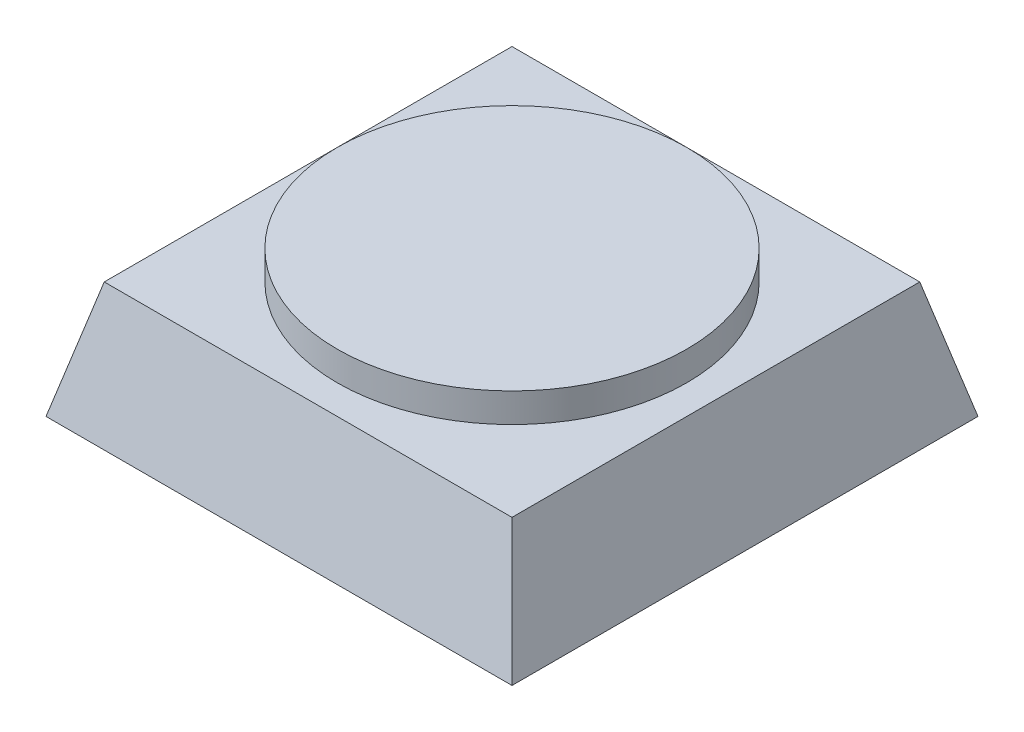
ISO-10303-21;
HEADER;
FILE_DESCRIPTION(('STEP AP214'),'2;1');
FILE_NAME('part.step','',(''),(''),'','','');
FILE_SCHEMA(('AUTOMOTIVE_DESIGN { 1 0 10303 214 1 1 1 1 }'));
ENDSEC;
DATA;
#1=APPLICATION_CONTEXT('core data for automotive mechanical design processes');
#2=APPLICATION_PROTOCOL_DEFINITION('international standard','automotive_design',2000,#1);
#3=PRODUCT_CONTEXT('',#1,'mechanical');
#4=PRODUCT('Part','Part','',(#3));
#5=PRODUCT_RELATED_PRODUCT_CATEGORY('part','',(#4));
#6=PRODUCT_DEFINITION_FORMATION('','',#4);
#7=PRODUCT_DEFINITION_CONTEXT('part definition',#1,'design');
#8=PRODUCT_DEFINITION('design','',#6,#7);
#9=PRODUCT_DEFINITION_SHAPE('','',#8);
#10=(LENGTH_UNIT() NAMED_UNIT(*) SI_UNIT(.MILLI.,.METRE.));
#11=(NAMED_UNIT(*) PLANE_ANGLE_UNIT() SI_UNIT($,.RADIAN.));
#12=(NAMED_UNIT(*) SI_UNIT($,.STERADIAN.) SOLID_ANGLE_UNIT());
#13=UNCERTAINTY_MEASURE_WITH_UNIT(LENGTH_MEASURE(1.E-05),#10,'distance_accuracy_value','');
#14=(GEOMETRIC_REPRESENTATION_CONTEXT(3) GLOBAL_UNCERTAINTY_ASSIGNED_CONTEXT((#13)) GLOBAL_UNIT_ASSIGNED_CONTEXT((#10,
#11,#12)) REPRESENTATION_CONTEXT('',''));
#15=CARTESIAN_POINT('',(0.,0.,0.));
#16=DIRECTION('',(0.,0.,1.));
#17=DIRECTION('',(1.,0.,0.));
#18=AXIS2_PLACEMENT_3D('',#15,#16,#17);
#19=CARTESIAN_POINT('',(0.,20.,0.));
#20=DIRECTION('',(0.,-1.,0.));
#21=DIRECTION('',(0.,0.,-1.));
#22=AXIS2_PLACEMENT_3D('',#19,#20,#21);
#23=PLANE('',#22);
#24=DIRECTION('',(1.,0.,0.));
#25=VECTOR('',#24,1.);
#26=CARTESIAN_POINT('',(0.,20.,35.));
#27=LINE('',#26,#25);
#28=CARTESIAN_POINT('',(-35.,20.,35.));
#29=VERTEX_POINT('',#28);
#30=CARTESIAN_POINT('',(35.,20.,35.));
#31=VERTEX_POINT('',#30);
#32=EDGE_CURVE('E122',#29,#31,#27,.T.);
#33=ORIENTED_EDGE('',*,*,#32,.T.);
#34=DIRECTION('',(0.,0.,-1.));
#35=VECTOR('',#34,1.);
#36=CARTESIAN_POINT('',(35.,20.,0.));
#37=LINE('',#36,#35);
#38=CARTESIAN_POINT('',(35.,20.,-35.));
#39=VERTEX_POINT('',#38);
#40=EDGE_CURVE('E11',#31,#39,#37,.T.);
#41=ORIENTED_EDGE('',*,*,#40,.T.);
#42=DIRECTION('',(-1.,0.,0.));
#43=VECTOR('',#42,1.);
#44=CARTESIAN_POINT('',(0.,20.,-35.));
#45=LINE('',#44,#43);
#46=CARTESIAN_POINT('',(-35.,20.,-35.));
#47=VERTEX_POINT('',#46);
#48=EDGE_CURVE('E49',#39,#47,#45,.T.);
#49=ORIENTED_EDGE('',*,*,#48,.T.);
#50=DIRECTION('',(0.,0.,1.));
#51=VECTOR('',#50,1.);
#52=CARTESIAN_POINT('',(-35.,20.,0.));
#53=LINE('',#52,#51);
#54=EDGE_CURVE('E131',#47,#29,#53,.T.);
#55=ORIENTED_EDGE('',*,*,#54,.T.);
#56=EDGE_LOOP('',(#33,#41,#49,#55));
#57=FACE_BOUND('',#56,.T.);
#58=CARTESIAN_POINT('',(0.,20.,0.));
#59=DIRECTION('',(0.,1.,0.));
#60=DIRECTION('',(0.,0.,1.));
#61=AXIS2_PLACEMENT_3D('',#58,#59,#60);
#62=CIRCLE('',#61,30.);
#63=CARTESIAN_POINT('',(0.,20.,30.));
#64=VERTEX_POINT('',#63);
#65=EDGE_CURVE('E119',#64,#64,#62,.T.);
#66=ORIENTED_EDGE('',*,*,#65,.F.);
#67=EDGE_LOOP('',(#66));
#68=FACE_BOUND('',#67,.T.);
#69=ADVANCED_FACE('F39',(#57,#68),#23,.F.);
#70=CARTESIAN_POINT('',(0.,0.,0.));
#71=DIRECTION('',(0.,-1.,0.));
#72=DIRECTION('',(0.,0.,-1.));
#73=AXIS2_PLACEMENT_3D('',#70,#71,#72);
#74=PLANE('',#73);
#75=DIRECTION('',(0.,0.,-1.));
#76=VECTOR('',#75,1.);
#77=CARTESIAN_POINT('',(40.,0.,40.));
#78=LINE('',#77,#76);
#79=CARTESIAN_POINT('',(40.,0.,40.));
#80=VERTEX_POINT('',#79);
#81=CARTESIAN_POINT('',(40.,0.,-40.));
#82=VERTEX_POINT('',#81);
#83=EDGE_CURVE('E85',#80,#82,#78,.T.);
#84=ORIENTED_EDGE('',*,*,#83,.F.);
#85=DIRECTION('',(1.,0.,0.));
#86=VECTOR('',#85,1.);
#87=CARTESIAN_POINT('',(-40.,0.,40.));
#88=LINE('',#87,#86);
#89=CARTESIAN_POINT('',(-40.,0.,40.));
#90=VERTEX_POINT('',#89);
#91=EDGE_CURVE('E123',#90,#80,#88,.T.);
#92=ORIENTED_EDGE('',*,*,#91,.F.);
#93=DIRECTION('',(0.,0.,1.));
#94=VECTOR('',#93,1.);
#95=CARTESIAN_POINT('',(-40.,0.,40.));
#96=LINE('',#95,#94);
#97=CARTESIAN_POINT('',(-40.,0.,-40.));
#98=VERTEX_POINT('',#97);
#99=EDGE_CURVE('E87',#98,#90,#96,.T.);
#100=ORIENTED_EDGE('',*,*,#99,.F.);
#101=DIRECTION('',(-1.,0.,0.));
#102=VECTOR('',#101,1.);
#103=CARTESIAN_POINT('',(-40.,0.,-40.));
#104=LINE('',#103,#102);
#105=EDGE_CURVE('E83',#82,#98,#104,.T.);
#106=ORIENTED_EDGE('',*,*,#105,.F.);
#107=EDGE_LOOP('',(#84,#92,#100,#106));
#108=FACE_BOUND('',#107,.T.);
#109=ADVANCED_FACE('F84',(#108),#74,.T.);
#110=CARTESIAN_POINT('',(0.,25.,0.));
#111=DIRECTION('',(0.,-1.,0.));
#112=DIRECTION('',(0.,0.,-1.));
#113=AXIS2_PLACEMENT_3D('',#110,#111,#112);
#114=CYLINDRICAL_SURFACE('',#113,30.);
#115=CARTESIAN_POINT('',(0.,25.,0.));
#116=DIRECTION('',(0.,1.,0.));
#117=DIRECTION('',(0.,0.,1.));
#118=AXIS2_PLACEMENT_3D('',#115,#116,#117);
#119=CIRCLE('',#118,30.);
#120=CARTESIAN_POINT('',(0.,25.,30.));
#121=VERTEX_POINT('',#120);
#122=EDGE_CURVE('E98',#121,#121,#119,.T.);
#123=ORIENTED_EDGE('',*,*,#122,.F.);
#124=EDGE_LOOP('',(#123));
#125=FACE_BOUND('',#124,.T.);
#126=ORIENTED_EDGE('',*,*,#65,.T.);
#127=EDGE_LOOP('',(#126));
#128=FACE_BOUND('',#127,.T.);
#129=ADVANCED_FACE('F149',(#125,#128),#114,.T.);
#130=CARTESIAN_POINT('',(0.,25.,0.));
#131=DIRECTION('',(0.,1.,0.));
#132=DIRECTION('',(0.,0.,1.));
#133=AXIS2_PLACEMENT_3D('',#130,#131,#132);
#134=PLANE('',#133);
#135=ORIENTED_EDGE('',*,*,#122,.T.);
#136=EDGE_LOOP('',(#135));
#137=FACE_BOUND('',#136,.T.);
#138=ADVANCED_FACE('F143',(#137),#134,.T.);
#139=CARTESIAN_POINT('',(-35.,20.,0.));
#140=DIRECTION('',(0.970142500145333,-0.24253562503633,0.));
#141=DIRECTION('',(0.,0.,1.));
#142=AXIS2_PLACEMENT_3D('',#139,#140,#141);
#143=PLANE('',#142);
#144=DIRECTION('',(-0.235702260395513,-0.942809041582065,-0.235702260395513));
#145=VECTOR('',#144,1.);
#146=CARTESIAN_POINT('',(-33.0555555555556,27.7777777777777,-33.0555555555556));
#147=LINE('',#146,#145);
#148=EDGE_CURVE('E104',#98,#47,#147,.F.);
#149=ORIENTED_EDGE('',*,*,#148,.F.);
#150=ORIENTED_EDGE('',*,*,#99,.T.);
#151=DIRECTION('',(-0.235702260395513,-0.942809041582065,0.235702260395513));
#152=VECTOR('',#151,1.);
#153=CARTESIAN_POINT('',(-33.0555555555556,27.7777777777777,33.0555555555556));
#154=LINE('',#153,#152);
#155=EDGE_CURVE('E43',#29,#90,#154,.T.);
#156=ORIENTED_EDGE('',*,*,#155,.F.);
#157=ORIENTED_EDGE('',*,*,#54,.F.);
#158=EDGE_LOOP('',(#149,#150,#156,#157));
#159=FACE_BOUND('',#158,.T.);
#160=ADVANCED_FACE('F41',(#159),#143,.F.);
#161=CARTESIAN_POINT('',(0.,20.,35.));
#162=DIRECTION('',(0.,-0.24253562503633,-0.970142500145333));
#163=DIRECTION('',(1.,0.,0.));
#164=AXIS2_PLACEMENT_3D('',#161,#162,#163);
#165=PLANE('',#164);
#166=ORIENTED_EDGE('',*,*,#155,.T.);
#167=ORIENTED_EDGE('',*,*,#91,.T.);
#168=DIRECTION('',(-0.235702260395513,0.942809041582065,-0.235702260395513));
#169=VECTOR('',#168,1.);
#170=CARTESIAN_POINT('',(33.0555555555556,27.7777777777777,33.0555555555556));
#171=LINE('',#170,#169);
#172=EDGE_CURVE('E95',#31,#80,#171,.F.);
#173=ORIENTED_EDGE('',*,*,#172,.F.);
#174=ORIENTED_EDGE('',*,*,#32,.F.);
#175=EDGE_LOOP('',(#166,#167,#173,#174));
#176=FACE_BOUND('',#175,.T.);
#177=ADVANCED_FACE('F136',(#176),#165,.F.);
#178=CARTESIAN_POINT('',(0.,20.,-35.));
#179=DIRECTION('',(0.,-0.24253562503633,0.970142500145333));
#180=DIRECTION('',(-1.,0.,0.));
#181=AXIS2_PLACEMENT_3D('',#178,#179,#180);
#182=PLANE('',#181);
#183=ORIENTED_EDGE('',*,*,#148,.T.);
#184=ORIENTED_EDGE('',*,*,#48,.F.);
#185=DIRECTION('',(0.235702260395513,-0.942809041582065,-0.235702260395513));
#186=VECTOR('',#185,1.);
#187=CARTESIAN_POINT('',(33.0555555555556,27.7777777777777,-33.0555555555556));
#188=LINE('',#187,#186);
#189=EDGE_CURVE('E57',#82,#39,#188,.F.);
#190=ORIENTED_EDGE('',*,*,#189,.F.);
#191=ORIENTED_EDGE('',*,*,#105,.T.);
#192=EDGE_LOOP('',(#183,#184,#190,#191));
#193=FACE_BOUND('',#192,.T.);
#194=ADVANCED_FACE('F100',(#193),#182,.F.);
#195=CARTESIAN_POINT('',(35.,20.,0.));
#196=DIRECTION('',(-0.970142500145333,-0.24253562503633,0.));
#197=DIRECTION('',(0.,0.,-1.));
#198=AXIS2_PLACEMENT_3D('',#195,#196,#197);
#199=PLANE('',#198);
#200=ORIENTED_EDGE('',*,*,#172,.T.);
#201=ORIENTED_EDGE('',*,*,#83,.T.);
#202=ORIENTED_EDGE('',*,*,#189,.T.);
#203=ORIENTED_EDGE('',*,*,#40,.F.);
#204=EDGE_LOOP('',(#200,#201,#202,#203));
#205=FACE_BOUND('',#204,.T.);
#206=ADVANCED_FACE('F93',(#205),#199,.F.);
#207=CLOSED_SHELL('',(#69,#109,#129,#138,#160,#177,#194,#206));
#208=MANIFOLD_SOLID_BREP('B2',#207);
#209=ADVANCED_BREP_SHAPE_REPRESENTATION('',(#18,#208),#14);
#210=SHAPE_DEFINITION_REPRESENTATION(#9,#209);
ENDSEC;
END-ISO-10303-21;
